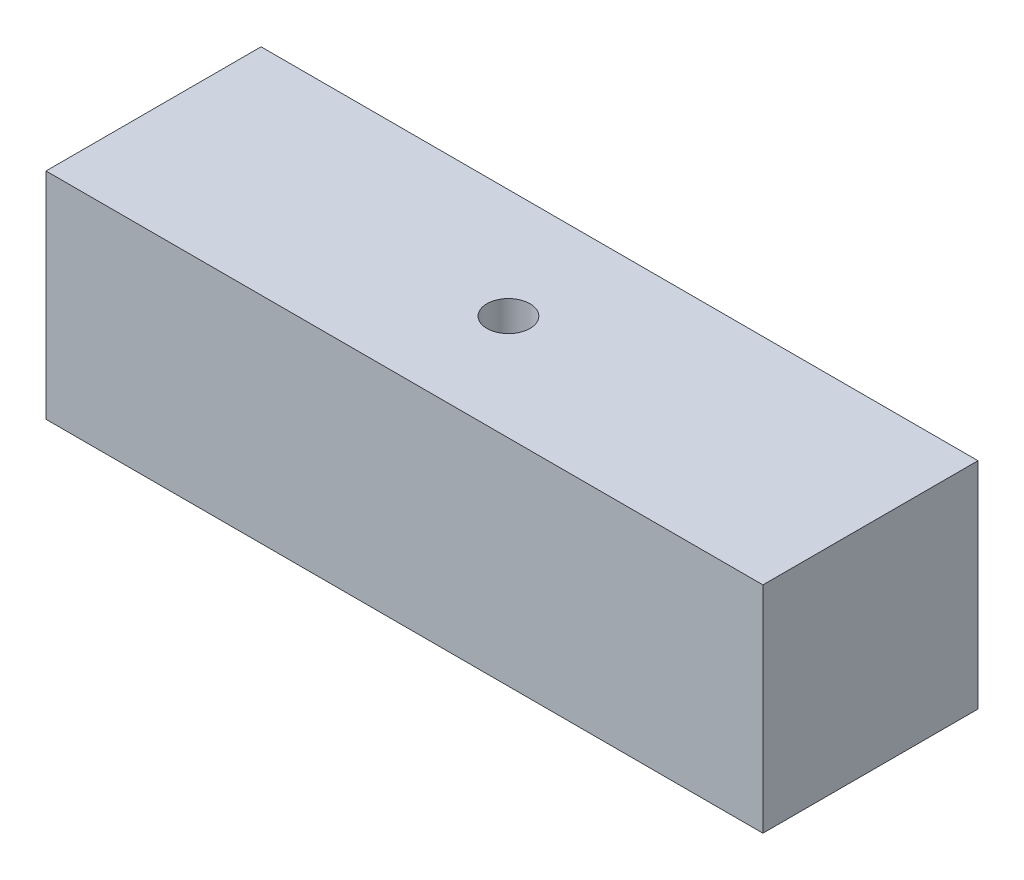
ISO-10303-21;
HEADER;
FILE_DESCRIPTION(('STEP AP214'),'2;1');
FILE_NAME('part.step','',(''),(''),'','','');
FILE_SCHEMA(('AUTOMOTIVE_DESIGN { 1 0 10303 214 1 1 1 1 }'));
ENDSEC;
DATA;
#1=APPLICATION_CONTEXT('core data for automotive mechanical design processes');
#2=APPLICATION_PROTOCOL_DEFINITION('international standard','automotive_design',2000,#1);
#3=PRODUCT_CONTEXT('',#1,'mechanical');
#4=PRODUCT('Part','Part','',(#3));
#5=PRODUCT_RELATED_PRODUCT_CATEGORY('part','',(#4));
#6=PRODUCT_DEFINITION_FORMATION('','',#4);
#7=PRODUCT_DEFINITION_CONTEXT('part definition',#1,'design');
#8=PRODUCT_DEFINITION('design','',#6,#7);
#9=PRODUCT_DEFINITION_SHAPE('','',#8);
#10=(LENGTH_UNIT() NAMED_UNIT(*) SI_UNIT(.MILLI.,.METRE.));
#11=(NAMED_UNIT(*) PLANE_ANGLE_UNIT() SI_UNIT($,.RADIAN.));
#12=(NAMED_UNIT(*) SI_UNIT($,.STERADIAN.) SOLID_ANGLE_UNIT());
#13=UNCERTAINTY_MEASURE_WITH_UNIT(LENGTH_MEASURE(1.E-05),#10,'distance_accuracy_value','');
#14=(GEOMETRIC_REPRESENTATION_CONTEXT(3) GLOBAL_UNCERTAINTY_ASSIGNED_CONTEXT((#13)) GLOBAL_UNIT_ASSIGNED_CONTEXT((#10,
#11,#12)) REPRESENTATION_CONTEXT('',''));
#15=CARTESIAN_POINT('',(0.,0.,0.));
#16=DIRECTION('',(0.,0.,1.));
#17=DIRECTION('',(1.,0.,0.));
#18=AXIS2_PLACEMENT_3D('',#15,#16,#17);
#19=CARTESIAN_POINT('',(-38.9205722142555,15.,-23.3027922951948));
#20=DIRECTION('',(1.,0.,0.));
#21=DIRECTION('',(0.,0.,-1.));
#22=AXIS2_PLACEMENT_3D('',#19,#20,#21);
#23=PLANE('',#22);
#24=DIRECTION('',(0.,0.,1.));
#25=VECTOR('',#24,1.);
#26=CARTESIAN_POINT('',(-38.9205722142555,0.,-23.3027922951948));
#27=LINE('',#26,#25);
#28=CARTESIAN_POINT('',(-38.9205722142555,0.,-23.3027922951948));
#29=VERTEX_POINT('',#28);
#30=CARTESIAN_POINT('',(-38.9205722142555,0.,-8.30279229519478));
#31=VERTEX_POINT('',#30);
#32=EDGE_CURVE('E96',#29,#31,#27,.T.);
#33=ORIENTED_EDGE('',*,*,#32,.T.);
#34=DIRECTION('',(0.,-1.,0.));
#35=VECTOR('',#34,1.);
#36=CARTESIAN_POINT('',(-38.9205722142555,15.,-8.30279229519478));
#37=LINE('',#36,#35);
#38=CARTESIAN_POINT('',(-38.9205722142555,15.,-8.30279229519478));
#39=VERTEX_POINT('',#38);
#40=EDGE_CURVE('E11',#39,#31,#37,.T.);
#41=ORIENTED_EDGE('',*,*,#40,.F.);
#42=DIRECTION('',(0.,0.,1.));
#43=VECTOR('',#42,1.);
#44=CARTESIAN_POINT('',(-38.9205722142555,15.,-23.3027922951948));
#45=LINE('',#44,#43);
#46=CARTESIAN_POINT('',(-38.9205722142555,15.,-23.3027922951948));
#47=VERTEX_POINT('',#46);
#48=EDGE_CURVE('E84',#47,#39,#45,.T.);
#49=ORIENTED_EDGE('',*,*,#48,.F.);
#50=DIRECTION('',(0.,-1.,0.));
#51=VECTOR('',#50,1.);
#52=CARTESIAN_POINT('',(-38.9205722142555,15.,-23.3027922951948));
#53=LINE('',#52,#51);
#54=EDGE_CURVE('E92',#47,#29,#53,.T.);
#55=ORIENTED_EDGE('',*,*,#54,.T.);
#56=EDGE_LOOP('',(#33,#41,#49,#55));
#57=FACE_BOUND('',#56,.T.);
#58=ADVANCED_FACE('F33',(#57),#23,.F.);
#59=CARTESIAN_POINT('',(-38.9205722142555,15.,-8.30279229519478));
#60=DIRECTION('',(0.,0.,-1.));
#61=DIRECTION('',(-1.,0.,0.));
#62=AXIS2_PLACEMENT_3D('',#59,#60,#61);
#63=PLANE('',#62);
#64=DIRECTION('',(1.,0.,0.));
#65=VECTOR('',#64,1.);
#66=CARTESIAN_POINT('',(-38.9205722142555,0.,-8.30279229519478));
#67=LINE('',#66,#65);
#68=CARTESIAN_POINT('',(11.0794277857445,0.,-8.30279229519478));
#69=VERTEX_POINT('',#68);
#70=EDGE_CURVE('E88',#31,#69,#67,.T.);
#71=ORIENTED_EDGE('',*,*,#70,.T.);
#72=DIRECTION('',(0.,-1.,0.));
#73=VECTOR('',#72,1.);
#74=CARTESIAN_POINT('',(11.0794277857445,15.,-8.30279229519478));
#75=LINE('',#74,#73);
#76=CARTESIAN_POINT('',(11.0794277857445,15.,-8.30279229519478));
#77=VERTEX_POINT('',#76);
#78=EDGE_CURVE('E41',#77,#69,#75,.T.);
#79=ORIENTED_EDGE('',*,*,#78,.F.);
#80=DIRECTION('',(1.,0.,0.));
#81=VECTOR('',#80,1.);
#82=CARTESIAN_POINT('',(-38.9205722142555,15.,-8.30279229519478));
#83=LINE('',#82,#81);
#84=EDGE_CURVE('E79',#39,#77,#83,.T.);
#85=ORIENTED_EDGE('',*,*,#84,.F.);
#86=ORIENTED_EDGE('',*,*,#40,.T.);
#87=EDGE_LOOP('',(#71,#79,#85,#86));
#88=FACE_BOUND('',#87,.T.);
#89=ADVANCED_FACE('F87',(#88),#63,.F.);
#90=CARTESIAN_POINT('',(11.0794277857445,15.,-23.3027922951948));
#91=DIRECTION('',(-1.,0.,0.));
#92=DIRECTION('',(0.,0.,1.));
#93=AXIS2_PLACEMENT_3D('',#90,#91,#92);
#94=PLANE('',#93);
#95=DIRECTION('',(0.,0.,-1.));
#96=VECTOR('',#95,1.);
#97=CARTESIAN_POINT('',(11.0794277857445,0.,-23.3027922951948));
#98=LINE('',#97,#96);
#99=CARTESIAN_POINT('',(11.0794277857445,0.,-23.3027922951948));
#100=VERTEX_POINT('',#99);
#101=EDGE_CURVE('E66',#69,#100,#98,.T.);
#102=ORIENTED_EDGE('',*,*,#101,.T.);
#103=DIRECTION('',(0.,-1.,0.));
#104=VECTOR('',#103,1.);
#105=CARTESIAN_POINT('',(11.0794277857445,15.,-23.3027922951948));
#106=LINE('',#105,#104);
#107=CARTESIAN_POINT('',(11.0794277857445,15.,-23.3027922951948));
#108=VERTEX_POINT('',#107);
#109=EDGE_CURVE('E89',#108,#100,#106,.T.);
#110=ORIENTED_EDGE('',*,*,#109,.F.);
#111=DIRECTION('',(0.,0.,-1.));
#112=VECTOR('',#111,1.);
#113=CARTESIAN_POINT('',(11.0794277857445,15.,-23.3027922951948));
#114=LINE('',#113,#112);
#115=EDGE_CURVE('E82',#77,#108,#114,.T.);
#116=ORIENTED_EDGE('',*,*,#115,.F.);
#117=ORIENTED_EDGE('',*,*,#78,.T.);
#118=EDGE_LOOP('',(#102,#110,#116,#117));
#119=FACE_BOUND('',#118,.T.);
#120=ADVANCED_FACE('F90',(#119),#94,.F.);
#121=CARTESIAN_POINT('',(-38.9205722142555,15.,-23.3027922951948));
#122=DIRECTION('',(0.,0.,1.));
#123=DIRECTION('',(1.,0.,0.));
#124=AXIS2_PLACEMENT_3D('',#121,#122,#123);
#125=PLANE('',#124);
#126=DIRECTION('',(-1.,0.,0.));
#127=VECTOR('',#126,1.);
#128=CARTESIAN_POINT('',(-38.9205722142555,0.,-23.3027922951948));
#129=LINE('',#128,#127);
#130=EDGE_CURVE('E72',#100,#29,#129,.T.);
#131=ORIENTED_EDGE('',*,*,#130,.T.);
#132=ORIENTED_EDGE('',*,*,#54,.F.);
#133=DIRECTION('',(-1.,0.,0.));
#134=VECTOR('',#133,1.);
#135=CARTESIAN_POINT('',(-38.9205722142555,15.,-23.3027922951948));
#136=LINE('',#135,#134);
#137=EDGE_CURVE('E49',#108,#47,#136,.T.);
#138=ORIENTED_EDGE('',*,*,#137,.F.);
#139=ORIENTED_EDGE('',*,*,#109,.T.);
#140=EDGE_LOOP('',(#131,#132,#138,#139));
#141=FACE_BOUND('',#140,.T.);
#142=ADVANCED_FACE('F104',(#141),#125,.F.);
#143=CARTESIAN_POINT('',(0.,15.,0.));
#144=DIRECTION('',(0.,1.,0.));
#145=DIRECTION('',(0.,0.,1.));
#146=AXIS2_PLACEMENT_3D('',#143,#144,#145);
#147=PLANE('',#146);
#148=CARTESIAN_POINT('',(-14.0287042986737,15.,-15.6637959904638));
#149=DIRECTION('',(0.,1.,0.));
#150=DIRECTION('',(0.,0.,1.));
#151=AXIS2_PLACEMENT_3D('',#148,#149,#150);
#152=CIRCLE('',#151,1.5);
#153=CARTESIAN_POINT('',(-14.0287042986737,15.,-14.1637959904638));
#154=VERTEX_POINT('',#153);
#155=EDGE_CURVE('E110',#154,#154,#152,.T.);
#156=ORIENTED_EDGE('',*,*,#155,.F.);
#157=EDGE_LOOP('',(#156));
#158=FACE_BOUND('',#157,.T.);
#159=ORIENTED_EDGE('',*,*,#48,.T.);
#160=ORIENTED_EDGE('',*,*,#84,.T.);
#161=ORIENTED_EDGE('',*,*,#115,.T.);
#162=ORIENTED_EDGE('',*,*,#137,.T.);
#163=EDGE_LOOP('',(#159,#160,#161,#162));
#164=FACE_BOUND('',#163,.T.);
#165=ADVANCED_FACE('F80',(#158,#164),#147,.T.);
#166=CARTESIAN_POINT('',(0.,0.,0.));
#167=DIRECTION('',(0.,1.,0.));
#168=DIRECTION('',(0.,0.,1.));
#169=AXIS2_PLACEMENT_3D('',#166,#167,#168);
#170=PLANE('',#169);
#171=ORIENTED_EDGE('',*,*,#32,.F.);
#172=ORIENTED_EDGE('',*,*,#130,.F.);
#173=ORIENTED_EDGE('',*,*,#101,.F.);
#174=ORIENTED_EDGE('',*,*,#70,.F.);
#175=EDGE_LOOP('',(#171,#172,#173,#174));
#176=FACE_BOUND('',#175,.T.);
#177=ADVANCED_FACE('F107',(#176),#170,.F.);
#178=CARTESIAN_POINT('',(-14.0287042986737,9.5,-15.6637959904638));
#179=DIRECTION('',(0.,1.,0.));
#180=DIRECTION('',(0.,0.,1.));
#181=AXIS2_PLACEMENT_3D('',#178,#179,#180);
#182=CYLINDRICAL_SURFACE('',#181,1.5);
#183=CARTESIAN_POINT('',(-14.0287042986737,9.5,-15.6637959904638));
#184=DIRECTION('',(0.,1.,0.));
#185=DIRECTION('',(0.,0.,1.));
#186=AXIS2_PLACEMENT_3D('',#183,#184,#185);
#187=CIRCLE('',#186,1.5);
#188=CARTESIAN_POINT('',(-14.0287042986737,9.5,-14.1637959904638));
#189=VERTEX_POINT('',#188);
#190=EDGE_CURVE('E99',#189,#189,#187,.T.);
#191=ORIENTED_EDGE('',*,*,#190,.F.);
#192=EDGE_LOOP('',(#191));
#193=FACE_BOUND('',#192,.T.);
#194=ORIENTED_EDGE('',*,*,#155,.T.);
#195=EDGE_LOOP('',(#194));
#196=FACE_BOUND('',#195,.T.);
#197=ADVANCED_FACE('F118',(#193,#196),#182,.F.);
#198=CARTESIAN_POINT('',(-14.0287042986737,9.5,-15.6637959904638));
#199=DIRECTION('',(0.,1.,0.));
#200=DIRECTION('',(0.,0.,1.));
#201=AXIS2_PLACEMENT_3D('',#198,#199,#200);
#202=PLANE('',#201);
#203=ORIENTED_EDGE('',*,*,#190,.T.);
#204=EDGE_LOOP('',(#203));
#205=FACE_BOUND('',#204,.T.);
#206=ADVANCED_FACE('F116',(#205),#202,.T.);
#207=CLOSED_SHELL('',(#58,#89,#120,#142,#165,#177,#197,#206));
#208=MANIFOLD_SOLID_BREP('B2',#207);
#209=ADVANCED_BREP_SHAPE_REPRESENTATION('',(#18,#208),#14);
#210=SHAPE_DEFINITION_REPRESENTATION(#9,#209);
ENDSEC;
END-ISO-10303-21;
